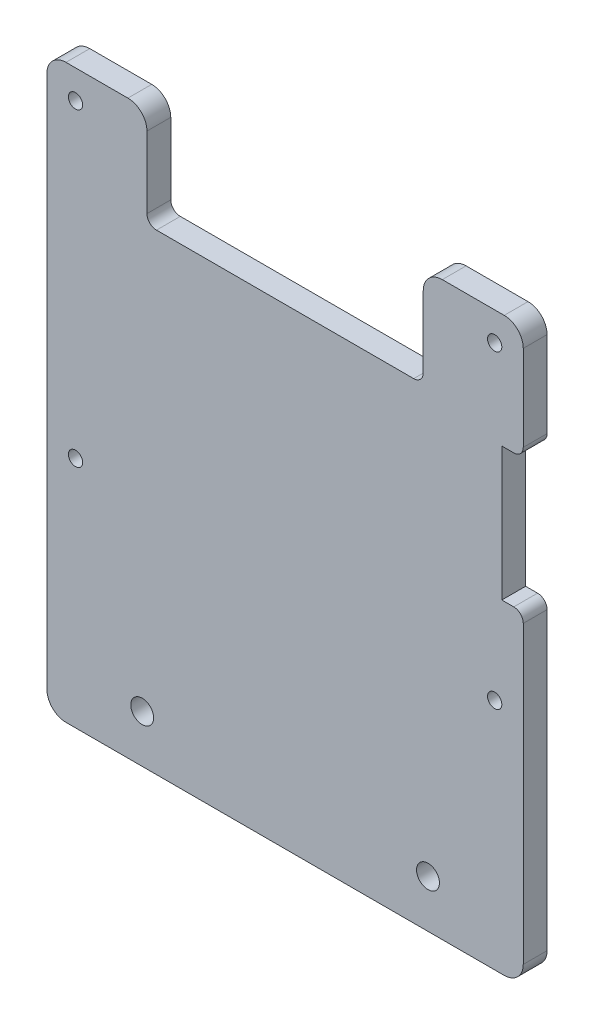
ISO-10303-21;
HEADER;
FILE_DESCRIPTION(('STEP AP214'),'2;1');
FILE_NAME('part.step','',(''),(''),'','','');
FILE_SCHEMA(('AUTOMOTIVE_DESIGN { 1 0 10303 214 1 1 1 1 }'));
ENDSEC;
DATA;
#1=APPLICATION_CONTEXT('core data for automotive mechanical design processes');
#2=APPLICATION_PROTOCOL_DEFINITION('international standard','automotive_design',2000,#1);
#3=PRODUCT_CONTEXT('',#1,'mechanical');
#4=PRODUCT('Part','Part','',(#3));
#5=PRODUCT_RELATED_PRODUCT_CATEGORY('part','',(#4));
#6=PRODUCT_DEFINITION_FORMATION('','',#4);
#7=PRODUCT_DEFINITION_CONTEXT('part definition',#1,'design');
#8=PRODUCT_DEFINITION('design','',#6,#7);
#9=PRODUCT_DEFINITION_SHAPE('','',#8);
#10=(LENGTH_UNIT() NAMED_UNIT(*) SI_UNIT(.MILLI.,.METRE.));
#11=(NAMED_UNIT(*) PLANE_ANGLE_UNIT() SI_UNIT($,.RADIAN.));
#12=(NAMED_UNIT(*) SI_UNIT($,.STERADIAN.) SOLID_ANGLE_UNIT());
#13=UNCERTAINTY_MEASURE_WITH_UNIT(LENGTH_MEASURE(1.E-05),#10,'distance_accuracy_value','');
#14=(GEOMETRIC_REPRESENTATION_CONTEXT(3) GLOBAL_UNCERTAINTY_ASSIGNED_CONTEXT((#13)) GLOBAL_UNIT_ASSIGNED_CONTEXT((#10,
#11,#12)) REPRESENTATION_CONTEXT('',''));
#15=CARTESIAN_POINT('',(0.,0.,0.));
#16=DIRECTION('',(0.,0.,1.));
#17=DIRECTION('',(1.,0.,0.));
#18=AXIS2_PLACEMENT_3D('',#15,#16,#17);
#19=CARTESIAN_POINT('',(0.,0.,5.));
#20=DIRECTION('',(0.,0.,-1.));
#21=DIRECTION('',(-1.,0.,0.));
#22=AXIS2_PLACEMENT_3D('',#19,#20,#21);
#23=PLANE('',#22);
#24=DIRECTION('',(0.,1.,0.));
#25=VECTOR('',#24,1.);
#26=CARTESIAN_POINT('',(50.,-60.,5.));
#27=LINE('',#26,#25);
#28=CARTESIAN_POINT('',(50.,-56.,5.));
#29=VERTEX_POINT('',#28);
#30=CARTESIAN_POINT('',(50.,6.,5.));
#31=VERTEX_POINT('',#30);
#32=EDGE_CURVE('E193',#29,#31,#27,.T.);
#33=ORIENTED_EDGE('',*,*,#32,.T.);
#34=CARTESIAN_POINT('',(48.,6.,5.));
#35=DIRECTION('',(0.,0.,-1.));
#36=DIRECTION('',(-1.,0.,0.));
#37=AXIS2_PLACEMENT_3D('',#34,#35,#36);
#38=CIRCLE('',#37,2.);
#39=CARTESIAN_POINT('',(48.,8.,5.));
#40=VERTEX_POINT('',#39);
#41=EDGE_CURVE('E189',#31,#40,#38,.F.);
#42=ORIENTED_EDGE('',*,*,#41,.T.);
#43=DIRECTION('',(-1.,0.,0.));
#44=VECTOR('',#43,1.);
#45=CARTESIAN_POINT('',(45.5,8.,5.));
#46=LINE('',#45,#44);
#47=CARTESIAN_POINT('',(45.5,8.,5.));
#48=VERTEX_POINT('',#47);
#49=EDGE_CURVE('E181',#40,#48,#46,.T.);
#50=ORIENTED_EDGE('',*,*,#49,.T.);
#51=DIRECTION('',(0.,1.,0.));
#52=VECTOR('',#51,1.);
#53=CARTESIAN_POINT('',(45.5,36.,5.));
#54=LINE('',#53,#52);
#55=CARTESIAN_POINT('',(45.5,36.,5.));
#56=VERTEX_POINT('',#55);
#57=EDGE_CURVE('E186',#48,#56,#54,.T.);
#58=ORIENTED_EDGE('',*,*,#57,.T.);
#59=DIRECTION('',(1.,0.,0.));
#60=VECTOR('',#59,1.);
#61=CARTESIAN_POINT('',(45.5,36.,5.));
#62=LINE('',#61,#60);
#63=CARTESIAN_POINT('',(48.,36.,5.));
#64=VERTEX_POINT('',#63);
#65=EDGE_CURVE('E207',#56,#64,#62,.T.);
#66=ORIENTED_EDGE('',*,*,#65,.T.);
#67=CARTESIAN_POINT('',(48.,38.,5.));
#68=DIRECTION('',(0.,0.,-1.));
#69=DIRECTION('',(-1.,0.,0.));
#70=AXIS2_PLACEMENT_3D('',#67,#68,#69);
#71=CIRCLE('',#70,2.);
#72=CARTESIAN_POINT('',(50.,38.,5.));
#73=VERTEX_POINT('',#72);
#74=EDGE_CURVE('E48',#64,#73,#71,.F.);
#75=ORIENTED_EDGE('',*,*,#74,.T.);
#76=DIRECTION('',(0.,1.,0.));
#77=VECTOR('',#76,1.);
#78=CARTESIAN_POINT('',(50.,36.,5.));
#79=LINE('',#78,#77);
#80=CARTESIAN_POINT('',(50.,56.,5.));
#81=VERTEX_POINT('',#80);
#82=EDGE_CURVE('E243',#73,#81,#79,.T.);
#83=ORIENTED_EDGE('',*,*,#82,.T.);
#84=CARTESIAN_POINT('',(46.,56.,5.));
#85=DIRECTION('',(0.,0.,-1.));
#86=DIRECTION('',(-1.,0.,0.));
#87=AXIS2_PLACEMENT_3D('',#84,#85,#86);
#88=CIRCLE('',#87,4.);
#89=CARTESIAN_POINT('',(46.,60.,5.));
#90=VERTEX_POINT('',#89);
#91=EDGE_CURVE('E268',#81,#90,#88,.F.);
#92=ORIENTED_EDGE('',*,*,#91,.T.);
#93=DIRECTION('',(-1.,0.,0.));
#94=VECTOR('',#93,1.);
#95=CARTESIAN_POINT('',(29.,60.,5.));
#96=LINE('',#95,#94);
#97=CARTESIAN_POINT('',(33.,60.,5.));
#98=VERTEX_POINT('',#97);
#99=EDGE_CURVE('E387',#90,#98,#96,.T.);
#100=ORIENTED_EDGE('',*,*,#99,.T.);
#101=CARTESIAN_POINT('',(33.,56.,5.));
#102=DIRECTION('',(0.,0.,-1.));
#103=DIRECTION('',(-1.,0.,0.));
#104=AXIS2_PLACEMENT_3D('',#101,#102,#103);
#105=CIRCLE('',#104,4.);
#106=CARTESIAN_POINT('',(29.,56.,5.));
#107=VERTEX_POINT('',#106);
#108=EDGE_CURVE('E276',#98,#107,#105,.F.);
#109=ORIENTED_EDGE('',*,*,#108,.T.);
#110=DIRECTION('',(0.,-1.,0.));
#111=VECTOR('',#110,1.);
#112=CARTESIAN_POINT('',(29.,39.,5.));
#113=LINE('',#112,#111);
#114=CARTESIAN_POINT('',(29.,41.,5.));
#115=VERTEX_POINT('',#114);
#116=EDGE_CURVE('E355',#107,#115,#113,.T.);
#117=ORIENTED_EDGE('',*,*,#116,.T.);
#118=CARTESIAN_POINT('',(27.,41.,5.));
#119=DIRECTION('',(0.,0.,-1.));
#120=DIRECTION('',(-1.,0.,0.));
#121=AXIS2_PLACEMENT_3D('',#118,#119,#120);
#122=CIRCLE('',#121,2.);
#123=CARTESIAN_POINT('',(27.,39.,5.));
#124=VERTEX_POINT('',#123);
#125=EDGE_CURVE('E328',#115,#124,#122,.T.);
#126=ORIENTED_EDGE('',*,*,#125,.T.);
#127=DIRECTION('',(-1.,0.,0.));
#128=VECTOR('',#127,1.);
#129=CARTESIAN_POINT('',(-29.,39.,5.));
#130=LINE('',#129,#128);
#131=CARTESIAN_POINT('',(-27.,39.,5.));
#132=VERTEX_POINT('',#131);
#133=EDGE_CURVE('E345',#124,#132,#130,.T.);
#134=ORIENTED_EDGE('',*,*,#133,.T.);
#135=CARTESIAN_POINT('',(-27.,41.,5.));
#136=DIRECTION('',(0.,0.,-1.));
#137=DIRECTION('',(-1.,0.,0.));
#138=AXIS2_PLACEMENT_3D('',#135,#136,#137);
#139=CIRCLE('',#138,2.);
#140=CARTESIAN_POINT('',(-29.,41.,5.));
#141=VERTEX_POINT('',#140);
#142=EDGE_CURVE('E11',#132,#141,#139,.T.);
#143=ORIENTED_EDGE('',*,*,#142,.T.);
#144=DIRECTION('',(0.,1.,0.));
#145=VECTOR('',#144,1.);
#146=CARTESIAN_POINT('',(-29.,60.,5.));
#147=LINE('',#146,#145);
#148=CARTESIAN_POINT('',(-29.,56.,5.));
#149=VERTEX_POINT('',#148);
#150=EDGE_CURVE('E344',#141,#149,#147,.T.);
#151=ORIENTED_EDGE('',*,*,#150,.T.);
#152=CARTESIAN_POINT('',(-33.,56.,5.));
#153=DIRECTION('',(0.,0.,-1.));
#154=DIRECTION('',(-1.,0.,0.));
#155=AXIS2_PLACEMENT_3D('',#152,#153,#154);
#156=CIRCLE('',#155,4.);
#157=CARTESIAN_POINT('',(-33.,60.,5.));
#158=VERTEX_POINT('',#157);
#159=EDGE_CURVE('E274',#149,#158,#156,.F.);
#160=ORIENTED_EDGE('',*,*,#159,.T.);
#161=DIRECTION('',(-1.,0.,0.));
#162=VECTOR('',#161,1.);
#163=CARTESIAN_POINT('',(-50.,60.,5.));
#164=LINE('',#163,#162);
#165=CARTESIAN_POINT('',(-46.,60.,5.));
#166=VERTEX_POINT('',#165);
#167=EDGE_CURVE('E350',#158,#166,#164,.T.);
#168=ORIENTED_EDGE('',*,*,#167,.T.);
#169=CARTESIAN_POINT('',(-46.,56.,5.));
#170=DIRECTION('',(0.,0.,-1.));
#171=DIRECTION('',(-1.,0.,0.));
#172=AXIS2_PLACEMENT_3D('',#169,#170,#171);
#173=CIRCLE('',#172,4.);
#174=CARTESIAN_POINT('',(-50.,56.,5.));
#175=VERTEX_POINT('',#174);
#176=EDGE_CURVE('E266',#166,#175,#173,.F.);
#177=ORIENTED_EDGE('',*,*,#176,.T.);
#178=DIRECTION('',(0.,-1.,0.));
#179=VECTOR('',#178,1.);
#180=CARTESIAN_POINT('',(-50.,-60.,5.));
#181=LINE('',#180,#179);
#182=CARTESIAN_POINT('',(-50.,-56.,5.));
#183=VERTEX_POINT('',#182);
#184=EDGE_CURVE('E353',#175,#183,#181,.T.);
#185=ORIENTED_EDGE('',*,*,#184,.T.);
#186=CARTESIAN_POINT('',(-46.,-56.,5.));
#187=DIRECTION('',(0.,0.,-1.));
#188=DIRECTION('',(-1.,0.,0.));
#189=AXIS2_PLACEMENT_3D('',#186,#187,#188);
#190=CIRCLE('',#189,4.);
#191=CARTESIAN_POINT('',(-46.,-60.,5.));
#192=VERTEX_POINT('',#191);
#193=EDGE_CURVE('E270',#183,#192,#190,.F.);
#194=ORIENTED_EDGE('',*,*,#193,.T.);
#195=DIRECTION('',(1.,0.,0.));
#196=VECTOR('',#195,1.);
#197=CARTESIAN_POINT('',(-50.,-60.,5.));
#198=LINE('',#197,#196);
#199=CARTESIAN_POINT('',(46.,-60.,5.));
#200=VERTEX_POINT('',#199);
#201=EDGE_CURVE('E361',#192,#200,#198,.T.);
#202=ORIENTED_EDGE('',*,*,#201,.T.);
#203=CARTESIAN_POINT('',(46.,-56.,5.));
#204=DIRECTION('',(0.,0.,-1.));
#205=DIRECTION('',(-1.,0.,0.));
#206=AXIS2_PLACEMENT_3D('',#203,#204,#205);
#207=CIRCLE('',#206,4.);
#208=EDGE_CURVE('E272',#200,#29,#207,.F.);
#209=ORIENTED_EDGE('',*,*,#208,.T.);
#210=EDGE_LOOP('',(#33,#42,#50,#58,#66,#75,#83,#92,#100,#109,#117,#126,#134,#143,#151,#160,#168,
#177,#185,#194,#202,#209));
#211=FACE_BOUND('',#210,.T.);
#212=CARTESIAN_POINT('',(-30.,-50.,5.));
#213=DIRECTION('',(0.,0.,1.));
#214=DIRECTION('',(1.,0.,0.));
#215=AXIS2_PLACEMENT_3D('',#212,#213,#214);
#216=CIRCLE('',#215,2.4);
#217=CARTESIAN_POINT('',(-27.6,-50.,5.));
#218=VERTEX_POINT('',#217);
#219=EDGE_CURVE('E215',#218,#218,#216,.T.);
#220=ORIENTED_EDGE('',*,*,#219,.F.);
#221=EDGE_LOOP('',(#220));
#222=FACE_BOUND('',#221,.T.);
#223=CARTESIAN_POINT('',(30.,-50.,5.));
#224=DIRECTION('',(0.,0.,1.));
#225=DIRECTION('',(1.,0.,0.));
#226=AXIS2_PLACEMENT_3D('',#223,#224,#225);
#227=CIRCLE('',#226,2.4);
#228=CARTESIAN_POINT('',(32.4,-50.,5.));
#229=VERTEX_POINT('',#228);
#230=EDGE_CURVE('E399',#229,#229,#227,.T.);
#231=ORIENTED_EDGE('',*,*,#230,.F.);
#232=EDGE_LOOP('',(#231));
#233=FACE_BOUND('',#232,.T.);
#234=CARTESIAN_POINT('',(-44.,54.,5.));
#235=DIRECTION('',(0.,0.,1.));
#236=DIRECTION('',(1.,0.,0.));
#237=AXIS2_PLACEMENT_3D('',#234,#235,#236);
#238=CIRCLE('',#237,1.5);
#239=CARTESIAN_POINT('',(-42.5,54.,5.));
#240=VERTEX_POINT('',#239);
#241=EDGE_CURVE('E405',#240,#240,#238,.T.);
#242=ORIENTED_EDGE('',*,*,#241,.F.);
#243=EDGE_LOOP('',(#242));
#244=FACE_BOUND('',#243,.T.);
#245=CARTESIAN_POINT('',(44.,54.,5.));
#246=DIRECTION('',(0.,0.,1.));
#247=DIRECTION('',(1.,0.,0.));
#248=AXIS2_PLACEMENT_3D('',#245,#246,#247);
#249=CIRCLE('',#248,1.5);
#250=CARTESIAN_POINT('',(45.5,54.,5.));
#251=VERTEX_POINT('',#250);
#252=EDGE_CURVE('E411',#251,#251,#249,.T.);
#253=ORIENTED_EDGE('',*,*,#252,.F.);
#254=EDGE_LOOP('',(#253));
#255=FACE_BOUND('',#254,.T.);
#256=CARTESIAN_POINT('',(-44.,-11.,5.));
#257=DIRECTION('',(0.,0.,1.));
#258=DIRECTION('',(1.,0.,0.));
#259=AXIS2_PLACEMENT_3D('',#256,#257,#258);
#260=CIRCLE('',#259,1.5);
#261=CARTESIAN_POINT('',(-42.5,-11.,5.));
#262=VERTEX_POINT('',#261);
#263=EDGE_CURVE('E417',#262,#262,#260,.T.);
#264=ORIENTED_EDGE('',*,*,#263,.F.);
#265=EDGE_LOOP('',(#264));
#266=FACE_BOUND('',#265,.T.);
#267=CARTESIAN_POINT('',(44.,-11.,5.));
#268=DIRECTION('',(0.,0.,1.));
#269=DIRECTION('',(1.,0.,0.));
#270=AXIS2_PLACEMENT_3D('',#267,#268,#269);
#271=CIRCLE('',#270,1.5);
#272=CARTESIAN_POINT('',(45.5,-11.,5.));
#273=VERTEX_POINT('',#272);
#274=EDGE_CURVE('E423',#273,#273,#271,.T.);
#275=ORIENTED_EDGE('',*,*,#274,.F.);
#276=EDGE_LOOP('',(#275));
#277=FACE_BOUND('',#276,.T.);
#278=ADVANCED_FACE('F33',(#211,#222,#233,#244,#255,#266,#277),#23,.F.);
#279=CARTESIAN_POINT('',(0.,0.,0.));
#280=DIRECTION('',(0.,0.,-1.));
#281=DIRECTION('',(-1.,0.,0.));
#282=AXIS2_PLACEMENT_3D('',#279,#280,#281);
#283=PLANE('',#282);
#284=CARTESIAN_POINT('',(-44.,-11.,0.));
#285=DIRECTION('',(0.,0.,1.));
#286=DIRECTION('',(1.,0.,0.));
#287=AXIS2_PLACEMENT_3D('',#284,#285,#286);
#288=CIRCLE('',#287,1.5);
#289=CARTESIAN_POINT('',(-42.5,-11.,0.));
#290=VERTEX_POINT('',#289);
#291=EDGE_CURVE('E420',#290,#290,#288,.T.);
#292=ORIENTED_EDGE('',*,*,#291,.T.);
#293=EDGE_LOOP('',(#292));
#294=FACE_BOUND('',#293,.T.);
#295=CARTESIAN_POINT('',(-44.,54.,0.));
#296=DIRECTION('',(0.,0.,1.));
#297=DIRECTION('',(1.,0.,0.));
#298=AXIS2_PLACEMENT_3D('',#295,#296,#297);
#299=CIRCLE('',#298,1.5);
#300=CARTESIAN_POINT('',(-42.5,54.,0.));
#301=VERTEX_POINT('',#300);
#302=EDGE_CURVE('E408',#301,#301,#299,.T.);
#303=ORIENTED_EDGE('',*,*,#302,.T.);
#304=EDGE_LOOP('',(#303));
#305=FACE_BOUND('',#304,.T.);
#306=CARTESIAN_POINT('',(-30.,-50.,0.));
#307=DIRECTION('',(0.,0.,1.));
#308=DIRECTION('',(1.,0.,0.));
#309=AXIS2_PLACEMENT_3D('',#306,#307,#308);
#310=CIRCLE('',#309,2.4);
#311=CARTESIAN_POINT('',(-27.6,-50.,0.));
#312=VERTEX_POINT('',#311);
#313=EDGE_CURVE('E396',#312,#312,#310,.T.);
#314=ORIENTED_EDGE('',*,*,#313,.T.);
#315=EDGE_LOOP('',(#314));
#316=FACE_BOUND('',#315,.T.);
#317=DIRECTION('',(-1.,0.,0.));
#318=VECTOR('',#317,1.);
#319=CARTESIAN_POINT('',(45.5,8.,0.));
#320=LINE('',#319,#318);
#321=CARTESIAN_POINT('',(48.,8.,0.));
#322=VERTEX_POINT('',#321);
#323=CARTESIAN_POINT('',(45.5,8.,0.));
#324=VERTEX_POINT('',#323);
#325=EDGE_CURVE('E199',#322,#324,#320,.T.);
#326=ORIENTED_EDGE('',*,*,#325,.F.);
#327=CARTESIAN_POINT('',(48.,6.,0.));
#328=DIRECTION('',(0.,0.,-1.));
#329=DIRECTION('',(-1.,0.,0.));
#330=AXIS2_PLACEMENT_3D('',#327,#328,#329);
#331=CIRCLE('',#330,2.);
#332=CARTESIAN_POINT('',(50.,6.,0.));
#333=VERTEX_POINT('',#332);
#334=EDGE_CURVE('E306',#322,#333,#331,.T.);
#335=ORIENTED_EDGE('',*,*,#334,.T.);
#336=DIRECTION('',(0.,1.,0.));
#337=VECTOR('',#336,1.);
#338=CARTESIAN_POINT('',(50.,-60.,0.));
#339=LINE('',#338,#337);
#340=CARTESIAN_POINT('',(50.,-56.,0.));
#341=VERTEX_POINT('',#340);
#342=EDGE_CURVE('E235',#341,#333,#339,.T.);
#343=ORIENTED_EDGE('',*,*,#342,.F.);
#344=CARTESIAN_POINT('',(46.,-56.,0.));
#345=DIRECTION('',(0.,0.,-1.));
#346=DIRECTION('',(-1.,0.,0.));
#347=AXIS2_PLACEMENT_3D('',#344,#345,#346);
#348=CIRCLE('',#347,4.);
#349=CARTESIAN_POINT('',(46.,-60.,0.));
#350=VERTEX_POINT('',#349);
#351=EDGE_CURVE('E254',#341,#350,#348,.T.);
#352=ORIENTED_EDGE('',*,*,#351,.T.);
#353=DIRECTION('',(1.,0.,0.));
#354=VECTOR('',#353,1.);
#355=CARTESIAN_POINT('',(-50.,-60.,0.));
#356=LINE('',#355,#354);
#357=CARTESIAN_POINT('',(-46.,-60.,0.));
#358=VERTEX_POINT('',#357);
#359=EDGE_CURVE('E232',#358,#350,#356,.T.);
#360=ORIENTED_EDGE('',*,*,#359,.F.);
#361=CARTESIAN_POINT('',(-46.,-56.,0.));
#362=DIRECTION('',(0.,0.,-1.));
#363=DIRECTION('',(-1.,0.,0.));
#364=AXIS2_PLACEMENT_3D('',#361,#362,#363);
#365=CIRCLE('',#364,4.);
#366=CARTESIAN_POINT('',(-50.,-56.,0.));
#367=VERTEX_POINT('',#366);
#368=EDGE_CURVE('E252',#358,#367,#365,.T.);
#369=ORIENTED_EDGE('',*,*,#368,.T.);
#370=DIRECTION('',(0.,-1.,0.));
#371=VECTOR('',#370,1.);
#372=CARTESIAN_POINT('',(-50.,-60.,0.));
#373=LINE('',#372,#371);
#374=CARTESIAN_POINT('',(-50.,56.,0.));
#375=VERTEX_POINT('',#374);
#376=EDGE_CURVE('E229',#375,#367,#373,.T.);
#377=ORIENTED_EDGE('',*,*,#376,.F.);
#378=CARTESIAN_POINT('',(-46.,56.,0.));
#379=DIRECTION('',(0.,0.,-1.));
#380=DIRECTION('',(-1.,0.,0.));
#381=AXIS2_PLACEMENT_3D('',#378,#379,#380);
#382=CIRCLE('',#381,4.);
#383=CARTESIAN_POINT('',(-46.,60.,0.));
#384=VERTEX_POINT('',#383);
#385=EDGE_CURVE('E247',#375,#384,#382,.T.);
#386=ORIENTED_EDGE('',*,*,#385,.T.);
#387=DIRECTION('',(-1.,0.,0.));
#388=VECTOR('',#387,1.);
#389=CARTESIAN_POINT('',(-50.,60.,0.));
#390=LINE('',#389,#388);
#391=CARTESIAN_POINT('',(-33.,60.,0.));
#392=VERTEX_POINT('',#391);
#393=EDGE_CURVE('E226',#392,#384,#390,.T.);
#394=ORIENTED_EDGE('',*,*,#393,.F.);
#395=CARTESIAN_POINT('',(-33.,56.,0.));
#396=DIRECTION('',(0.,0.,-1.));
#397=DIRECTION('',(-1.,0.,0.));
#398=AXIS2_PLACEMENT_3D('',#395,#396,#397);
#399=CIRCLE('',#398,4.);
#400=CARTESIAN_POINT('',(-29.,56.,0.));
#401=VERTEX_POINT('',#400);
#402=EDGE_CURVE('E256',#392,#401,#399,.T.);
#403=ORIENTED_EDGE('',*,*,#402,.T.);
#404=DIRECTION('',(0.,1.,0.));
#405=VECTOR('',#404,1.);
#406=CARTESIAN_POINT('',(-29.,60.,0.));
#407=LINE('',#406,#405);
#408=CARTESIAN_POINT('',(-29.,41.,0.));
#409=VERTEX_POINT('',#408);
#410=EDGE_CURVE('E224',#409,#401,#407,.T.);
#411=ORIENTED_EDGE('',*,*,#410,.F.);
#412=CARTESIAN_POINT('',(-27.,41.,0.));
#413=DIRECTION('',(0.,0.,-1.));
#414=DIRECTION('',(-1.,0.,0.));
#415=AXIS2_PLACEMENT_3D('',#412,#413,#414);
#416=CIRCLE('',#415,2.);
#417=CARTESIAN_POINT('',(-27.,39.,0.));
#418=VERTEX_POINT('',#417);
#419=EDGE_CURVE('E41',#409,#418,#416,.F.);
#420=ORIENTED_EDGE('',*,*,#419,.T.);
#421=DIRECTION('',(-1.,0.,0.));
#422=VECTOR('',#421,1.);
#423=CARTESIAN_POINT('',(-29.,39.,0.));
#424=LINE('',#423,#422);
#425=CARTESIAN_POINT('',(27.,39.,0.));
#426=VERTEX_POINT('',#425);
#427=EDGE_CURVE('E221',#426,#418,#424,.T.);
#428=ORIENTED_EDGE('',*,*,#427,.F.);
#429=CARTESIAN_POINT('',(27.,41.,0.));
#430=DIRECTION('',(0.,0.,-1.));
#431=DIRECTION('',(-1.,0.,0.));
#432=AXIS2_PLACEMENT_3D('',#429,#430,#431);
#433=CIRCLE('',#432,2.);
#434=CARTESIAN_POINT('',(29.,41.,0.));
#435=VERTEX_POINT('',#434);
#436=EDGE_CURVE('E326',#426,#435,#433,.F.);
#437=ORIENTED_EDGE('',*,*,#436,.T.);
#438=DIRECTION('',(0.,-1.,0.));
#439=VECTOR('',#438,1.);
#440=CARTESIAN_POINT('',(29.,39.,0.));
#441=LINE('',#440,#439);
#442=CARTESIAN_POINT('',(29.,56.,0.));
#443=VERTEX_POINT('',#442);
#444=EDGE_CURVE('E218',#443,#435,#441,.T.);
#445=ORIENTED_EDGE('',*,*,#444,.F.);
#446=CARTESIAN_POINT('',(33.,56.,0.));
#447=DIRECTION('',(0.,0.,-1.));
#448=DIRECTION('',(-1.,0.,0.));
#449=AXIS2_PLACEMENT_3D('',#446,#447,#448);
#450=CIRCLE('',#449,4.);
#451=CARTESIAN_POINT('',(33.,60.,0.));
#452=VERTEX_POINT('',#451);
#453=EDGE_CURVE('E259',#443,#452,#450,.T.);
#454=ORIENTED_EDGE('',*,*,#453,.T.);
#455=DIRECTION('',(-1.,0.,0.));
#456=VECTOR('',#455,1.);
#457=CARTESIAN_POINT('',(29.,60.,0.));
#458=LINE('',#457,#456);
#459=CARTESIAN_POINT('',(46.,60.,0.));
#460=VERTEX_POINT('',#459);
#461=EDGE_CURVE('E214',#460,#452,#458,.T.);
#462=ORIENTED_EDGE('',*,*,#461,.F.);
#463=CARTESIAN_POINT('',(46.,56.,0.));
#464=DIRECTION('',(0.,0.,-1.));
#465=DIRECTION('',(-1.,0.,0.));
#466=AXIS2_PLACEMENT_3D('',#463,#464,#465);
#467=CIRCLE('',#466,4.);
#468=CARTESIAN_POINT('',(50.,56.,0.));
#469=VERTEX_POINT('',#468);
#470=EDGE_CURVE('E249',#460,#469,#467,.T.);
#471=ORIENTED_EDGE('',*,*,#470,.T.);
#472=DIRECTION('',(0.,1.,0.));
#473=VECTOR('',#472,1.);
#474=CARTESIAN_POINT('',(50.,36.,0.));
#475=LINE('',#474,#473);
#476=CARTESIAN_POINT('',(50.,38.,0.));
#477=VERTEX_POINT('',#476);
#478=EDGE_CURVE('E212',#477,#469,#475,.T.);
#479=ORIENTED_EDGE('',*,*,#478,.F.);
#480=CARTESIAN_POINT('',(48.,38.,0.));
#481=DIRECTION('',(0.,0.,-1.));
#482=DIRECTION('',(-1.,0.,0.));
#483=AXIS2_PLACEMENT_3D('',#480,#481,#482);
#484=CIRCLE('',#483,2.);
#485=CARTESIAN_POINT('',(48.,36.,0.));
#486=VERTEX_POINT('',#485);
#487=EDGE_CURVE('E304',#477,#486,#484,.T.);
#488=ORIENTED_EDGE('',*,*,#487,.T.);
#489=DIRECTION('',(1.,0.,0.));
#490=VECTOR('',#489,1.);
#491=CARTESIAN_POINT('',(45.5,36.,0.));
#492=LINE('',#491,#490);
#493=CARTESIAN_POINT('',(45.5,36.,0.));
#494=VERTEX_POINT('',#493);
#495=EDGE_CURVE('E241',#494,#486,#492,.T.);
#496=ORIENTED_EDGE('',*,*,#495,.F.);
#497=DIRECTION('',(0.,1.,0.));
#498=VECTOR('',#497,1.);
#499=CARTESIAN_POINT('',(45.5,36.,0.));
#500=LINE('',#499,#498);
#501=EDGE_CURVE('E239',#324,#494,#500,.T.);
#502=ORIENTED_EDGE('',*,*,#501,.F.);
#503=EDGE_LOOP('',(#326,#335,#343,#352,#360,#369,#377,#386,#394,#403,#411,#420,#428,#437,#445,
#454,#462,#471,#479,#488,#496,#502));
#504=FACE_BOUND('',#503,.T.);
#505=CARTESIAN_POINT('',(30.,-50.,0.));
#506=DIRECTION('',(0.,0.,1.));
#507=DIRECTION('',(1.,0.,0.));
#508=AXIS2_PLACEMENT_3D('',#505,#506,#507);
#509=CIRCLE('',#508,2.4);
#510=CARTESIAN_POINT('',(32.4,-50.,0.));
#511=VERTEX_POINT('',#510);
#512=EDGE_CURVE('E402',#511,#511,#509,.T.);
#513=ORIENTED_EDGE('',*,*,#512,.T.);
#514=EDGE_LOOP('',(#513));
#515=FACE_BOUND('',#514,.T.);
#516=CARTESIAN_POINT('',(44.,54.,0.));
#517=DIRECTION('',(0.,0.,1.));
#518=DIRECTION('',(1.,0.,0.));
#519=AXIS2_PLACEMENT_3D('',#516,#517,#518);
#520=CIRCLE('',#519,1.5);
#521=CARTESIAN_POINT('',(45.5,54.,0.));
#522=VERTEX_POINT('',#521);
#523=EDGE_CURVE('E414',#522,#522,#520,.T.);
#524=ORIENTED_EDGE('',*,*,#523,.T.);
#525=EDGE_LOOP('',(#524));
#526=FACE_BOUND('',#525,.T.);
#527=CARTESIAN_POINT('',(44.,-11.,0.));
#528=DIRECTION('',(0.,0.,1.));
#529=DIRECTION('',(1.,0.,0.));
#530=AXIS2_PLACEMENT_3D('',#527,#528,#529);
#531=CIRCLE('',#530,1.5);
#532=CARTESIAN_POINT('',(45.5,-11.,0.));
#533=VERTEX_POINT('',#532);
#534=EDGE_CURVE('E426',#533,#533,#531,.T.);
#535=ORIENTED_EDGE('',*,*,#534,.T.);
#536=EDGE_LOOP('',(#535));
#537=FACE_BOUND('',#536,.T.);
#538=ADVANCED_FACE('F332',(#294,#305,#316,#504,#515,#526,#537),#283,.T.);
#539=CARTESIAN_POINT('',(50.,36.,5.));
#540=DIRECTION('',(-1.,0.,0.));
#541=DIRECTION('',(0.,0.,1.));
#542=AXIS2_PLACEMENT_3D('',#539,#540,#541);
#543=PLANE('',#542);
#544=ORIENTED_EDGE('',*,*,#82,.F.);
#545=DIRECTION('',(0.,0.,-1.));
#546=VECTOR('',#545,1.);
#547=CARTESIAN_POINT('',(50.,38.,5.));
#548=LINE('',#547,#546);
#549=EDGE_CURVE('E312',#73,#477,#548,.T.);
#550=ORIENTED_EDGE('',*,*,#549,.T.);
#551=ORIENTED_EDGE('',*,*,#478,.T.);
#552=DIRECTION('',(0.,0.,-1.));
#553=VECTOR('',#552,1.);
#554=CARTESIAN_POINT('',(50.,56.,5.));
#555=LINE('',#554,#553);
#556=EDGE_CURVE('E299',#469,#81,#555,.F.);
#557=ORIENTED_EDGE('',*,*,#556,.T.);
#558=EDGE_LOOP('',(#544,#550,#551,#557));
#559=FACE_BOUND('',#558,.T.);
#560=ADVANCED_FACE('F378',(#559),#543,.F.);
#561=CARTESIAN_POINT('',(29.,60.,5.));
#562=DIRECTION('',(0.,-1.,0.));
#563=DIRECTION('',(0.,0.,-1.));
#564=AXIS2_PLACEMENT_3D('',#561,#562,#563);
#565=PLANE('',#564);
#566=ORIENTED_EDGE('',*,*,#461,.T.);
#567=DIRECTION('',(0.,0.,-1.));
#568=VECTOR('',#567,1.);
#569=CARTESIAN_POINT('',(33.,60.,5.));
#570=LINE('',#569,#568);
#571=EDGE_CURVE('E264',#452,#98,#570,.F.);
#572=ORIENTED_EDGE('',*,*,#571,.T.);
#573=ORIENTED_EDGE('',*,*,#99,.F.);
#574=DIRECTION('',(0.,0.,-1.));
#575=VECTOR('',#574,1.);
#576=CARTESIAN_POINT('',(46.,60.,5.));
#577=LINE('',#576,#575);
#578=EDGE_CURVE('E261',#90,#460,#577,.T.);
#579=ORIENTED_EDGE('',*,*,#578,.T.);
#580=EDGE_LOOP('',(#566,#572,#573,#579));
#581=FACE_BOUND('',#580,.T.);
#582=ADVANCED_FACE('F390',(#581),#565,.F.);
#583=CARTESIAN_POINT('',(29.,39.,5.));
#584=DIRECTION('',(1.,0.,0.));
#585=DIRECTION('',(0.,1.,0.));
#586=AXIS2_PLACEMENT_3D('',#583,#584,#585);
#587=PLANE('',#586);
#588=ORIENTED_EDGE('',*,*,#444,.T.);
#589=DIRECTION('',(0.,0.,-1.));
#590=VECTOR('',#589,1.);
#591=CARTESIAN_POINT('',(29.,41.,5.));
#592=LINE('',#591,#590);
#593=EDGE_CURVE('E321',#435,#115,#592,.F.);
#594=ORIENTED_EDGE('',*,*,#593,.T.);
#595=ORIENTED_EDGE('',*,*,#116,.F.);
#596=DIRECTION('',(0.,0.,-1.));
#597=VECTOR('',#596,1.);
#598=CARTESIAN_POINT('',(29.,56.,5.));
#599=LINE('',#598,#597);
#600=EDGE_CURVE('E202',#107,#443,#599,.T.);
#601=ORIENTED_EDGE('',*,*,#600,.T.);
#602=EDGE_LOOP('',(#588,#594,#595,#601));
#603=FACE_BOUND('',#602,.T.);
#604=ADVANCED_FACE('F471',(#603),#587,.F.);
#605=CARTESIAN_POINT('',(-29.,39.,5.));
#606=DIRECTION('',(0.,-1.,0.));
#607=DIRECTION('',(0.,0.,-1.));
#608=AXIS2_PLACEMENT_3D('',#605,#606,#607);
#609=PLANE('',#608);
#610=ORIENTED_EDGE('',*,*,#133,.F.);
#611=DIRECTION('',(0.,0.,-1.));
#612=VECTOR('',#611,1.);
#613=CARTESIAN_POINT('',(27.,39.,0.));
#614=LINE('',#613,#612);
#615=EDGE_CURVE('E318',#124,#426,#614,.T.);
#616=ORIENTED_EDGE('',*,*,#615,.T.);
#617=ORIENTED_EDGE('',*,*,#427,.T.);
#618=DIRECTION('',(0.,0.,-1.));
#619=VECTOR('',#618,1.);
#620=CARTESIAN_POINT('',(-27.,39.,5.));
#621=LINE('',#620,#619);
#622=EDGE_CURVE('E316',#418,#132,#621,.F.);
#623=ORIENTED_EDGE('',*,*,#622,.T.);
#624=EDGE_LOOP('',(#610,#616,#617,#623));
#625=FACE_BOUND('',#624,.T.);
#626=ADVANCED_FACE('F339',(#625),#609,.F.);
#627=CARTESIAN_POINT('',(-29.,60.,5.));
#628=DIRECTION('',(-1.,0.,0.));
#629=DIRECTION('',(0.,-1.,0.));
#630=AXIS2_PLACEMENT_3D('',#627,#628,#629);
#631=PLANE('',#630);
#632=ORIENTED_EDGE('',*,*,#150,.F.);
#633=DIRECTION('',(0.,0.,-1.));
#634=VECTOR('',#633,1.);
#635=CARTESIAN_POINT('',(-29.,41.,0.));
#636=LINE('',#635,#634);
#637=EDGE_CURVE('E323',#141,#409,#636,.T.);
#638=ORIENTED_EDGE('',*,*,#637,.T.);
#639=ORIENTED_EDGE('',*,*,#410,.T.);
#640=DIRECTION('',(0.,0.,-1.));
#641=VECTOR('',#640,1.);
#642=CARTESIAN_POINT('',(-29.,56.,5.));
#643=LINE('',#642,#641);
#644=EDGE_CURVE('E283',#401,#149,#643,.F.);
#645=ORIENTED_EDGE('',*,*,#644,.T.);
#646=EDGE_LOOP('',(#632,#638,#639,#645));
#647=FACE_BOUND('',#646,.T.);
#648=ADVANCED_FACE('F347',(#647),#631,.F.);
#649=CARTESIAN_POINT('',(-50.,60.,5.));
#650=DIRECTION('',(0.,-1.,0.));
#651=DIRECTION('',(0.,0.,-1.));
#652=AXIS2_PLACEMENT_3D('',#649,#650,#651);
#653=PLANE('',#652);
#654=ORIENTED_EDGE('',*,*,#167,.F.);
#655=DIRECTION('',(0.,0.,-1.));
#656=VECTOR('',#655,1.);
#657=CARTESIAN_POINT('',(-33.,60.,5.));
#658=LINE('',#657,#656);
#659=EDGE_CURVE('E280',#158,#392,#658,.T.);
#660=ORIENTED_EDGE('',*,*,#659,.T.);
#661=ORIENTED_EDGE('',*,*,#393,.T.);
#662=DIRECTION('',(0.,0.,-1.));
#663=VECTOR('',#662,1.);
#664=CARTESIAN_POINT('',(-46.,60.,5.));
#665=LINE('',#664,#663);
#666=EDGE_CURVE('E278',#384,#166,#665,.F.);
#667=ORIENTED_EDGE('',*,*,#666,.T.);
#668=EDGE_LOOP('',(#654,#660,#661,#667));
#669=FACE_BOUND('',#668,.T.);
#670=ADVANCED_FACE('F462',(#669),#653,.F.);
#671=CARTESIAN_POINT('',(-50.,-60.,5.));
#672=DIRECTION('',(1.,0.,0.));
#673=DIRECTION('',(0.,0.,-1.));
#674=AXIS2_PLACEMENT_3D('',#671,#672,#673);
#675=PLANE('',#674);
#676=ORIENTED_EDGE('',*,*,#376,.T.);
#677=DIRECTION('',(0.,0.,-1.));
#678=VECTOR('',#677,1.);
#679=CARTESIAN_POINT('',(-50.,-56.,5.));
#680=LINE('',#679,#678);
#681=EDGE_CURVE('E297',#367,#183,#680,.F.);
#682=ORIENTED_EDGE('',*,*,#681,.T.);
#683=ORIENTED_EDGE('',*,*,#184,.F.);
#684=DIRECTION('',(0.,0.,-1.));
#685=VECTOR('',#684,1.);
#686=CARTESIAN_POINT('',(-50.,56.,5.));
#687=LINE('',#686,#685);
#688=EDGE_CURVE('E294',#175,#375,#687,.T.);
#689=ORIENTED_EDGE('',*,*,#688,.T.);
#690=EDGE_LOOP('',(#676,#682,#683,#689));
#691=FACE_BOUND('',#690,.T.);
#692=ADVANCED_FACE('F458',(#691),#675,.F.);
#693=CARTESIAN_POINT('',(-50.,-60.,5.));
#694=DIRECTION('',(0.,1.,0.));
#695=DIRECTION('',(0.,0.,1.));
#696=AXIS2_PLACEMENT_3D('',#693,#694,#695);
#697=PLANE('',#696);
#698=ORIENTED_EDGE('',*,*,#359,.T.);
#699=DIRECTION('',(0.,0.,-1.));
#700=VECTOR('',#699,1.);
#701=CARTESIAN_POINT('',(46.,-60.,5.));
#702=LINE('',#701,#700);
#703=EDGE_CURVE('E292',#350,#200,#702,.F.);
#704=ORIENTED_EDGE('',*,*,#703,.T.);
#705=ORIENTED_EDGE('',*,*,#201,.F.);
#706=DIRECTION('',(0.,0.,-1.));
#707=VECTOR('',#706,1.);
#708=CARTESIAN_POINT('',(-46.,-60.,5.));
#709=LINE('',#708,#707);
#710=EDGE_CURVE('E289',#192,#358,#709,.T.);
#711=ORIENTED_EDGE('',*,*,#710,.T.);
#712=EDGE_LOOP('',(#698,#704,#705,#711));
#713=FACE_BOUND('',#712,.T.);
#714=ADVANCED_FACE('F455',(#713),#697,.F.);
#715=CARTESIAN_POINT('',(50.,-60.,5.));
#716=DIRECTION('',(-1.,0.,0.));
#717=DIRECTION('',(0.,0.,1.));
#718=AXIS2_PLACEMENT_3D('',#715,#716,#717);
#719=PLANE('',#718);
#720=ORIENTED_EDGE('',*,*,#342,.T.);
#721=DIRECTION('',(0.,0.,-1.));
#722=VECTOR('',#721,1.);
#723=CARTESIAN_POINT('',(50.,6.,5.));
#724=LINE('',#723,#722);
#725=EDGE_CURVE('E308',#333,#31,#724,.F.);
#726=ORIENTED_EDGE('',*,*,#725,.T.);
#727=ORIENTED_EDGE('',*,*,#32,.F.);
#728=DIRECTION('',(0.,0.,-1.));
#729=VECTOR('',#728,1.);
#730=CARTESIAN_POINT('',(50.,-56.,5.));
#731=LINE('',#730,#729);
#732=EDGE_CURVE('E286',#29,#341,#731,.T.);
#733=ORIENTED_EDGE('',*,*,#732,.T.);
#734=EDGE_LOOP('',(#720,#726,#727,#733));
#735=FACE_BOUND('',#734,.T.);
#736=ADVANCED_FACE('F452',(#735),#719,.F.);
#737=CARTESIAN_POINT('',(45.5,8.,5.));
#738=DIRECTION('',(0.,-1.,0.));
#739=DIRECTION('',(0.,0.,-1.));
#740=AXIS2_PLACEMENT_3D('',#737,#738,#739);
#741=PLANE('',#740);
#742=ORIENTED_EDGE('',*,*,#49,.F.);
#743=DIRECTION('',(0.,0.,-1.));
#744=VECTOR('',#743,1.);
#745=CARTESIAN_POINT('',(48.,8.,5.));
#746=LINE('',#745,#744);
#747=EDGE_CURVE('E302',#40,#322,#746,.T.);
#748=ORIENTED_EDGE('',*,*,#747,.T.);
#749=ORIENTED_EDGE('',*,*,#325,.T.);
#750=DIRECTION('',(0.,0.,-1.));
#751=VECTOR('',#750,1.);
#752=CARTESIAN_POINT('',(45.5,8.,5.));
#753=LINE('',#752,#751);
#754=EDGE_CURVE('E196',#48,#324,#753,.T.);
#755=ORIENTED_EDGE('',*,*,#754,.F.);
#756=EDGE_LOOP('',(#742,#748,#749,#755));
#757=FACE_BOUND('',#756,.T.);
#758=ADVANCED_FACE('F197',(#757),#741,.F.);
#759=CARTESIAN_POINT('',(45.5,36.,5.));
#760=DIRECTION('',(-1.,0.,0.));
#761=DIRECTION('',(0.,0.,1.));
#762=AXIS2_PLACEMENT_3D('',#759,#760,#761);
#763=PLANE('',#762);
#764=ORIENTED_EDGE('',*,*,#501,.T.);
#765=DIRECTION('',(0.,0.,-1.));
#766=VECTOR('',#765,1.);
#767=CARTESIAN_POINT('',(45.5,36.,5.));
#768=LINE('',#767,#766);
#769=EDGE_CURVE('E203',#56,#494,#768,.T.);
#770=ORIENTED_EDGE('',*,*,#769,.F.);
#771=ORIENTED_EDGE('',*,*,#57,.F.);
#772=ORIENTED_EDGE('',*,*,#754,.T.);
#773=EDGE_LOOP('',(#764,#770,#771,#772));
#774=FACE_BOUND('',#773,.T.);
#775=ADVANCED_FACE('F205',(#774),#763,.F.);
#776=CARTESIAN_POINT('',(45.5,36.,5.));
#777=DIRECTION('',(0.,1.,0.));
#778=DIRECTION('',(0.,0.,1.));
#779=AXIS2_PLACEMENT_3D('',#776,#777,#778);
#780=PLANE('',#779);
#781=ORIENTED_EDGE('',*,*,#495,.T.);
#782=DIRECTION('',(0.,0.,-1.));
#783=VECTOR('',#782,1.);
#784=CARTESIAN_POINT('',(48.,36.,5.));
#785=LINE('',#784,#783);
#786=EDGE_CURVE('E56',#486,#64,#785,.F.);
#787=ORIENTED_EDGE('',*,*,#786,.T.);
#788=ORIENTED_EDGE('',*,*,#65,.F.);
#789=ORIENTED_EDGE('',*,*,#769,.T.);
#790=EDGE_LOOP('',(#781,#787,#788,#789));
#791=FACE_BOUND('',#790,.T.);
#792=ADVANCED_FACE('F372',(#791),#780,.F.);
#793=CARTESIAN_POINT('',(-30.,-50.,5.));
#794=DIRECTION('',(0.,0.,-1.));
#795=DIRECTION('',(-1.,0.,0.));
#796=AXIS2_PLACEMENT_3D('',#793,#794,#795);
#797=CYLINDRICAL_SURFACE('',#796,2.4);
#798=ORIENTED_EDGE('',*,*,#219,.T.);
#799=EDGE_LOOP('',(#798));
#800=FACE_BOUND('',#799,.T.);
#801=ORIENTED_EDGE('',*,*,#313,.F.);
#802=EDGE_LOOP('',(#801));
#803=FACE_BOUND('',#802,.T.);
#804=ADVANCED_FACE('F443',(#800,#803),#797,.F.);
#805=CARTESIAN_POINT('',(30.,-50.,5.));
#806=DIRECTION('',(0.,0.,-1.));
#807=DIRECTION('',(-1.,0.,0.));
#808=AXIS2_PLACEMENT_3D('',#805,#806,#807);
#809=CYLINDRICAL_SURFACE('',#808,2.4);
#810=ORIENTED_EDGE('',*,*,#230,.T.);
#811=EDGE_LOOP('',(#810));
#812=FACE_BOUND('',#811,.T.);
#813=ORIENTED_EDGE('',*,*,#512,.F.);
#814=EDGE_LOOP('',(#813));
#815=FACE_BOUND('',#814,.T.);
#816=ADVANCED_FACE('F686',(#812,#815),#809,.F.);
#817=CARTESIAN_POINT('',(-44.,54.,5.));
#818=DIRECTION('',(0.,0.,-1.));
#819=DIRECTION('',(-1.,0.,0.));
#820=AXIS2_PLACEMENT_3D('',#817,#818,#819);
#821=CYLINDRICAL_SURFACE('',#820,1.5);
#822=ORIENTED_EDGE('',*,*,#241,.T.);
#823=EDGE_LOOP('',(#822));
#824=FACE_BOUND('',#823,.T.);
#825=ORIENTED_EDGE('',*,*,#302,.F.);
#826=EDGE_LOOP('',(#825));
#827=FACE_BOUND('',#826,.T.);
#828=ADVANCED_FACE('F676',(#824,#827),#821,.F.);
#829=CARTESIAN_POINT('',(44.,54.,5.));
#830=DIRECTION('',(0.,0.,-1.));
#831=DIRECTION('',(-1.,0.,0.));
#832=AXIS2_PLACEMENT_3D('',#829,#830,#831);
#833=CYLINDRICAL_SURFACE('',#832,1.5);
#834=ORIENTED_EDGE('',*,*,#252,.T.);
#835=EDGE_LOOP('',(#834));
#836=FACE_BOUND('',#835,.T.);
#837=ORIENTED_EDGE('',*,*,#523,.F.);
#838=EDGE_LOOP('',(#837));
#839=FACE_BOUND('',#838,.T.);
#840=ADVANCED_FACE('F666',(#836,#839),#833,.F.);
#841=CARTESIAN_POINT('',(-44.,-11.,5.));
#842=DIRECTION('',(0.,0.,-1.));
#843=DIRECTION('',(-1.,0.,0.));
#844=AXIS2_PLACEMENT_3D('',#841,#842,#843);
#845=CYLINDRICAL_SURFACE('',#844,1.5);
#846=ORIENTED_EDGE('',*,*,#263,.T.);
#847=EDGE_LOOP('',(#846));
#848=FACE_BOUND('',#847,.T.);
#849=ORIENTED_EDGE('',*,*,#291,.F.);
#850=EDGE_LOOP('',(#849));
#851=FACE_BOUND('',#850,.T.);
#852=ADVANCED_FACE('F657',(#848,#851),#845,.F.);
#853=CARTESIAN_POINT('',(44.,-11.,5.));
#854=DIRECTION('',(0.,0.,-1.));
#855=DIRECTION('',(-1.,0.,0.));
#856=AXIS2_PLACEMENT_3D('',#853,#854,#855);
#857=CYLINDRICAL_SURFACE('',#856,1.5);
#858=ORIENTED_EDGE('',*,*,#274,.T.);
#859=EDGE_LOOP('',(#858));
#860=FACE_BOUND('',#859,.T.);
#861=ORIENTED_EDGE('',*,*,#534,.F.);
#862=EDGE_LOOP('',(#861));
#863=FACE_BOUND('',#862,.T.);
#864=ADVANCED_FACE('F432',(#860,#863),#857,.F.);
#865=CARTESIAN_POINT('',(33.,56.,5.));
#866=DIRECTION('',(0.,0.,-1.));
#867=DIRECTION('',(-1.,0.,0.));
#868=AXIS2_PLACEMENT_3D('',#865,#866,#867);
#869=CYLINDRICAL_SURFACE('',#868,4.);
#870=ORIENTED_EDGE('',*,*,#108,.F.);
#871=ORIENTED_EDGE('',*,*,#571,.F.);
#872=ORIENTED_EDGE('',*,*,#453,.F.);
#873=ORIENTED_EDGE('',*,*,#600,.F.);
#874=EDGE_LOOP('',(#870,#871,#872,#873));
#875=FACE_BOUND('',#874,.T.);
#876=ADVANCED_FACE('F479',(#875),#869,.T.);
#877=CARTESIAN_POINT('',(-33.,56.,5.));
#878=DIRECTION('',(0.,0.,-1.));
#879=DIRECTION('',(-1.,0.,0.));
#880=AXIS2_PLACEMENT_3D('',#877,#878,#879);
#881=CYLINDRICAL_SURFACE('',#880,4.);
#882=ORIENTED_EDGE('',*,*,#159,.F.);
#883=ORIENTED_EDGE('',*,*,#644,.F.);
#884=ORIENTED_EDGE('',*,*,#402,.F.);
#885=ORIENTED_EDGE('',*,*,#659,.F.);
#886=EDGE_LOOP('',(#882,#883,#884,#885));
#887=FACE_BOUND('',#886,.T.);
#888=ADVANCED_FACE('F482',(#887),#881,.T.);
#889=CARTESIAN_POINT('',(46.,-56.,5.));
#890=DIRECTION('',(0.,0.,-1.));
#891=DIRECTION('',(-1.,0.,0.));
#892=AXIS2_PLACEMENT_3D('',#889,#890,#891);
#893=CYLINDRICAL_SURFACE('',#892,4.);
#894=ORIENTED_EDGE('',*,*,#208,.F.);
#895=ORIENTED_EDGE('',*,*,#703,.F.);
#896=ORIENTED_EDGE('',*,*,#351,.F.);
#897=ORIENTED_EDGE('',*,*,#732,.F.);
#898=EDGE_LOOP('',(#894,#895,#896,#897));
#899=FACE_BOUND('',#898,.T.);
#900=ADVANCED_FACE('F486',(#899),#893,.T.);
#901=CARTESIAN_POINT('',(-46.,-56.,5.));
#902=DIRECTION('',(0.,0.,-1.));
#903=DIRECTION('',(-1.,0.,0.));
#904=AXIS2_PLACEMENT_3D('',#901,#902,#903);
#905=CYLINDRICAL_SURFACE('',#904,4.);
#906=ORIENTED_EDGE('',*,*,#193,.F.);
#907=ORIENTED_EDGE('',*,*,#681,.F.);
#908=ORIENTED_EDGE('',*,*,#368,.F.);
#909=ORIENTED_EDGE('',*,*,#710,.F.);
#910=EDGE_LOOP('',(#906,#907,#908,#909));
#911=FACE_BOUND('',#910,.T.);
#912=ADVANCED_FACE('F490',(#911),#905,.T.);
#913=CARTESIAN_POINT('',(46.,56.,5.));
#914=DIRECTION('',(0.,0.,-1.));
#915=DIRECTION('',(-1.,0.,0.));
#916=AXIS2_PLACEMENT_3D('',#913,#914,#915);
#917=CYLINDRICAL_SURFACE('',#916,4.);
#918=ORIENTED_EDGE('',*,*,#91,.F.);
#919=ORIENTED_EDGE('',*,*,#556,.F.);
#920=ORIENTED_EDGE('',*,*,#470,.F.);
#921=ORIENTED_EDGE('',*,*,#578,.F.);
#922=EDGE_LOOP('',(#918,#919,#920,#921));
#923=FACE_BOUND('',#922,.T.);
#924=ADVANCED_FACE('F384',(#923),#917,.T.);
#925=CARTESIAN_POINT('',(-46.,56.,5.));
#926=DIRECTION('',(0.,0.,-1.));
#927=DIRECTION('',(-1.,0.,0.));
#928=AXIS2_PLACEMENT_3D('',#925,#926,#927);
#929=CYLINDRICAL_SURFACE('',#928,4.);
#930=ORIENTED_EDGE('',*,*,#176,.F.);
#931=ORIENTED_EDGE('',*,*,#666,.F.);
#932=ORIENTED_EDGE('',*,*,#385,.F.);
#933=ORIENTED_EDGE('',*,*,#688,.F.);
#934=EDGE_LOOP('',(#930,#931,#932,#933));
#935=FACE_BOUND('',#934,.T.);
#936=ADVANCED_FACE('F497',(#935),#929,.T.);
#937=CARTESIAN_POINT('',(48.,6.,5.));
#938=DIRECTION('',(0.,0.,-1.));
#939=DIRECTION('',(-1.,0.,0.));
#940=AXIS2_PLACEMENT_3D('',#937,#938,#939);
#941=CYLINDRICAL_SURFACE('',#940,2.);
#942=ORIENTED_EDGE('',*,*,#41,.F.);
#943=ORIENTED_EDGE('',*,*,#725,.F.);
#944=ORIENTED_EDGE('',*,*,#334,.F.);
#945=ORIENTED_EDGE('',*,*,#747,.F.);
#946=EDGE_LOOP('',(#942,#943,#944,#945));
#947=FACE_BOUND('',#946,.T.);
#948=ADVANCED_FACE('F369',(#947),#941,.T.);
#949=CARTESIAN_POINT('',(48.,38.,5.));
#950=DIRECTION('',(0.,0.,-1.));
#951=DIRECTION('',(-1.,0.,0.));
#952=AXIS2_PLACEMENT_3D('',#949,#950,#951);
#953=CYLINDRICAL_SURFACE('',#952,2.);
#954=ORIENTED_EDGE('',*,*,#74,.F.);
#955=ORIENTED_EDGE('',*,*,#786,.F.);
#956=ORIENTED_EDGE('',*,*,#487,.F.);
#957=ORIENTED_EDGE('',*,*,#549,.F.);
#958=EDGE_LOOP('',(#954,#955,#956,#957));
#959=FACE_BOUND('',#958,.T.);
#960=ADVANCED_FACE('F375',(#959),#953,.T.);
#961=CARTESIAN_POINT('',(27.,41.,5.));
#962=DIRECTION('',(0.,0.,1.));
#963=DIRECTION('',(1.,0.,0.));
#964=AXIS2_PLACEMENT_3D('',#961,#962,#963);
#965=CYLINDRICAL_SURFACE('',#964,2.);
#966=ORIENTED_EDGE('',*,*,#125,.F.);
#967=ORIENTED_EDGE('',*,*,#593,.F.);
#968=ORIENTED_EDGE('',*,*,#436,.F.);
#969=ORIENTED_EDGE('',*,*,#615,.F.);
#970=EDGE_LOOP('',(#966,#967,#968,#969));
#971=FACE_BOUND('',#970,.T.);
#972=ADVANCED_FACE('F504',(#971),#965,.F.);
#973=CARTESIAN_POINT('',(-27.,41.,5.));
#974=DIRECTION('',(0.,0.,1.));
#975=DIRECTION('',(1.,0.,0.));
#976=AXIS2_PLACEMENT_3D('',#973,#974,#975);
#977=CYLINDRICAL_SURFACE('',#976,2.);
#978=ORIENTED_EDGE('',*,*,#142,.F.);
#979=ORIENTED_EDGE('',*,*,#622,.F.);
#980=ORIENTED_EDGE('',*,*,#419,.F.);
#981=ORIENTED_EDGE('',*,*,#637,.F.);
#982=EDGE_LOOP('',(#978,#979,#980,#981));
#983=FACE_BOUND('',#982,.T.);
#984=ADVANCED_FACE('F35',(#983),#977,.F.);
#985=CLOSED_SHELL('',(#278,#538,#560,#582,#604,#626,#648,#670,#692,#714,#736,#758,#775,#792,
#804,#816,#828,#840,#852,#864,#876,#888,#900,#912,#924,#936,#948,#960,#972,#984));
#986=MANIFOLD_SOLID_BREP('B2',#985);
#987=ADVANCED_BREP_SHAPE_REPRESENTATION('',(#18,#986),#14);
#988=SHAPE_DEFINITION_REPRESENTATION(#9,#987);
ENDSEC;
END-ISO-10303-21;
